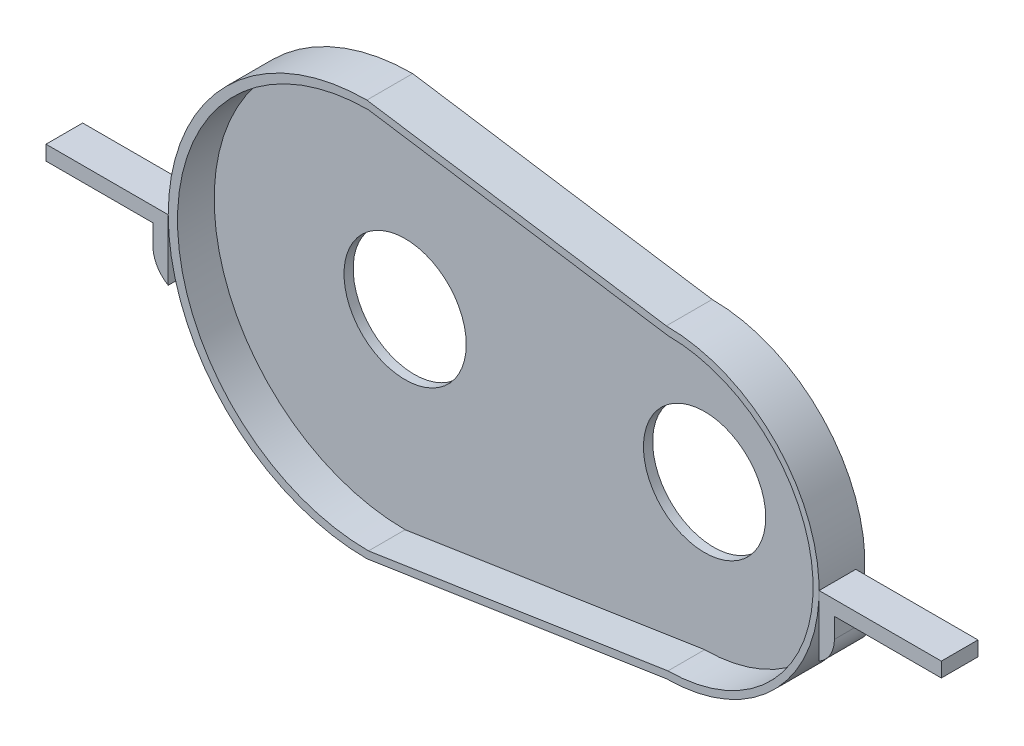
ISO-10303-21;
HEADER;
FILE_DESCRIPTION(('STEP AP214'),'2;1');
FILE_NAME('part.step','',(''),(''),'','','');
FILE_SCHEMA(('AUTOMOTIVE_DESIGN { 1 0 10303 214 1 1 1 1 }'));
ENDSEC;
DATA;
#1=APPLICATION_CONTEXT('core data for automotive mechanical design processes');
#2=APPLICATION_PROTOCOL_DEFINITION('international standard','automotive_design',2000,#1);
#3=PRODUCT_CONTEXT('',#1,'mechanical');
#4=PRODUCT('Part','Part','',(#3));
#5=PRODUCT_RELATED_PRODUCT_CATEGORY('part','',(#4));
#6=PRODUCT_DEFINITION_FORMATION('','',#4);
#7=PRODUCT_DEFINITION_CONTEXT('part definition',#1,'design');
#8=PRODUCT_DEFINITION('design','',#6,#7);
#9=PRODUCT_DEFINITION_SHAPE('','',#8);
#10=(LENGTH_UNIT() NAMED_UNIT(*) SI_UNIT(.MILLI.,.METRE.));
#11=(NAMED_UNIT(*) PLANE_ANGLE_UNIT() SI_UNIT($,.RADIAN.));
#12=(NAMED_UNIT(*) SI_UNIT($,.STERADIAN.) SOLID_ANGLE_UNIT());
#13=UNCERTAINTY_MEASURE_WITH_UNIT(LENGTH_MEASURE(1.E-05),#10,'distance_accuracy_value','');
#14=(GEOMETRIC_REPRESENTATION_CONTEXT(3) GLOBAL_UNCERTAINTY_ASSIGNED_CONTEXT((#13)) GLOBAL_UNIT_ASSIGNED_CONTEXT((#10,
#11,#12)) REPRESENTATION_CONTEXT('',''));
#15=CARTESIAN_POINT('',(0.,0.,0.));
#16=DIRECTION('',(0.,0.,1.));
#17=DIRECTION('',(1.,0.,0.));
#18=AXIS2_PLACEMENT_3D('',#15,#16,#17);
#19=CARTESIAN_POINT('',(-161.393356643357,-4.8015420475913,0.));
#20=DIRECTION('',(-1.,0.,0.));
#21=DIRECTION('',(0.,0.,1.));
#22=AXIS2_PLACEMENT_3D('',#19,#20,#21);
#23=PLANE('',#22);
#24=DIRECTION('',(0.,1.,0.));
#25=VECTOR('',#24,1.);
#26=CARTESIAN_POINT('',(-161.393356643357,-4.8015420475913,-12.));
#27=LINE('',#26,#25);
#28=CARTESIAN_POINT('',(-161.393356643357,-4.8015420475913,-12.));
#29=VERTEX_POINT('',#28);
#30=CARTESIAN_POINT('',(-161.393356643357,0.,-12.));
#31=VERTEX_POINT('',#30);
#32=EDGE_CURVE('E109',#29,#31,#27,.T.);
#33=ORIENTED_EDGE('',*,*,#32,.F.);
#34=DIRECTION('',(0.,0.,-1.));
#35=VECTOR('',#34,1.);
#36=CARTESIAN_POINT('',(-161.393356643357,-4.8015420475913,0.));
#37=LINE('',#36,#35);
#38=CARTESIAN_POINT('',(-161.393356643357,-4.8015420475913,0.));
#39=VERTEX_POINT('',#38);
#40=EDGE_CURVE('E95',#39,#29,#37,.T.);
#41=ORIENTED_EDGE('',*,*,#40,.F.);
#42=DIRECTION('',(0.,1.,0.));
#43=VECTOR('',#42,1.);
#44=CARTESIAN_POINT('',(-161.393356643357,-4.8015420475913,0.));
#45=LINE('',#44,#43);
#46=CARTESIAN_POINT('',(-161.393356643357,0.,0.));
#47=VERTEX_POINT('',#46);
#48=EDGE_CURVE('E118',#39,#47,#45,.T.);
#49=ORIENTED_EDGE('',*,*,#48,.T.);
#50=DIRECTION('',(0.,0.,-1.));
#51=VECTOR('',#50,1.);
#52=CARTESIAN_POINT('',(-161.393356643357,0.,0.));
#53=LINE('',#52,#51);
#54=EDGE_CURVE('E110',#47,#31,#53,.T.);
#55=ORIENTED_EDGE('',*,*,#54,.T.);
#56=EDGE_LOOP('',(#33,#41,#49,#55));
#57=FACE_BOUND('',#56,.T.);
#58=ADVANCED_FACE('F44',(#57),#23,.T.);
#59=CARTESIAN_POINT('',(-126.393356643357,-4.8015420475913,0.));
#60=DIRECTION('',(0.,-1.,0.));
#61=DIRECTION('',(1.,0.,0.));
#62=AXIS2_PLACEMENT_3D('',#59,#60,#61);
#63=PLANE('',#62);
#64=DIRECTION('',(-1.,0.,0.));
#65=VECTOR('',#64,1.);
#66=CARTESIAN_POINT('',(-126.393356643357,-4.8015420475913,-12.));
#67=LINE('',#66,#65);
#68=CARTESIAN_POINT('',(-126.393356643357,-4.8015420475913,-12.));
#69=VERTEX_POINT('',#68);
#70=EDGE_CURVE('E100',#69,#29,#67,.T.);
#71=ORIENTED_EDGE('',*,*,#70,.F.);
#72=DIRECTION('',(0.,0.,-1.));
#73=VECTOR('',#72,1.);
#74=CARTESIAN_POINT('',(-126.393356643357,-4.8015420475913,0.));
#75=LINE('',#74,#73);
#76=CARTESIAN_POINT('',(-126.393356643357,-4.8015420475913,0.));
#77=VERTEX_POINT('',#76);
#78=EDGE_CURVE('E106',#77,#69,#75,.T.);
#79=ORIENTED_EDGE('',*,*,#78,.F.);
#80=DIRECTION('',(-1.,0.,0.));
#81=VECTOR('',#80,1.);
#82=CARTESIAN_POINT('',(-126.393356643357,-4.8015420475913,0.));
#83=LINE('',#82,#81);
#84=EDGE_CURVE('E102',#77,#39,#83,.T.);
#85=ORIENTED_EDGE('',*,*,#84,.T.);
#86=ORIENTED_EDGE('',*,*,#40,.T.);
#87=EDGE_LOOP('',(#71,#79,#85,#86));
#88=FACE_BOUND('',#87,.T.);
#89=ADVANCED_FACE('F97',(#88),#63,.T.);
#90=CARTESIAN_POINT('',(-126.393356643357,-20.,0.));
#91=DIRECTION('',(-1.,0.,0.));
#92=DIRECTION('',(0.,0.,1.));
#93=AXIS2_PLACEMENT_3D('',#90,#91,#92);
#94=PLANE('',#93);
#95=DIRECTION('',(0.,1.,0.));
#96=VECTOR('',#95,1.);
#97=CARTESIAN_POINT('',(-126.393356643357,-20.,-12.));
#98=LINE('',#97,#96);
#99=CARTESIAN_POINT('',(-126.393356643357,-11.3397459621556,-12.));
#100=VERTEX_POINT('',#99);
#101=EDGE_CURVE('E116',#100,#69,#98,.T.);
#102=ORIENTED_EDGE('',*,*,#101,.F.);
#103=DIRECTION('',(0.,0.,-1.));
#104=VECTOR('',#103,1.);
#105=CARTESIAN_POINT('',(-126.393356643357,-11.3397459621556,0.));
#106=LINE('',#105,#104);
#107=CARTESIAN_POINT('',(-126.393356643357,-11.3397459621556,0.));
#108=VERTEX_POINT('',#107);
#109=EDGE_CURVE('E52',#100,#108,#106,.F.);
#110=ORIENTED_EDGE('',*,*,#109,.T.);
#111=DIRECTION('',(0.,1.,0.));
#112=VECTOR('',#111,1.);
#113=CARTESIAN_POINT('',(-126.393356643357,-20.,0.));
#114=LINE('',#113,#112);
#115=EDGE_CURVE('E129',#108,#77,#114,.T.);
#116=ORIENTED_EDGE('',*,*,#115,.T.);
#117=ORIENTED_EDGE('',*,*,#78,.T.);
#118=EDGE_LOOP('',(#102,#110,#116,#117));
#119=FACE_BOUND('',#118,.T.);
#120=ADVANCED_FACE('F154',(#119),#94,.T.);
#121=CARTESIAN_POINT('',(-121.393356643357,0.,0.));
#122=DIRECTION('',(1.,0.,0.));
#123=DIRECTION('',(0.,0.,-1.));
#124=AXIS2_PLACEMENT_3D('',#121,#122,#123);
#125=PLANE('',#124);
#126=DIRECTION('',(0.,-1.,0.));
#127=VECTOR('',#126,1.);
#128=CARTESIAN_POINT('',(-121.393356643357,0.,-12.));
#129=LINE('',#128,#127);
#130=CARTESIAN_POINT('',(-121.393356643357,0.,-12.));
#131=VERTEX_POINT('',#130);
#132=CARTESIAN_POINT('',(-121.393356643357,-20.,-12.));
#133=VERTEX_POINT('',#132);
#134=EDGE_CURVE('E120',#131,#133,#129,.T.);
#135=ORIENTED_EDGE('',*,*,#134,.F.);
#136=DIRECTION('',(0.,0.,-1.));
#137=VECTOR('',#136,1.);
#138=CARTESIAN_POINT('',(-121.393356643357,0.,0.));
#139=LINE('',#138,#137);
#140=CARTESIAN_POINT('',(-121.393356643357,0.,0.));
#141=VERTEX_POINT('',#140);
#142=EDGE_CURVE('E139',#141,#131,#139,.T.);
#143=ORIENTED_EDGE('',*,*,#142,.F.);
#144=DIRECTION('',(0.,-1.,0.));
#145=VECTOR('',#144,1.);
#146=CARTESIAN_POINT('',(-121.393356643357,0.,0.));
#147=LINE('',#146,#145);
#148=CARTESIAN_POINT('',(-121.393356643357,-20.,0.));
#149=VERTEX_POINT('',#148);
#150=EDGE_CURVE('E131',#141,#149,#147,.T.);
#151=ORIENTED_EDGE('',*,*,#150,.T.);
#152=DIRECTION('',(0.,0.,-1.));
#153=VECTOR('',#152,1.);
#154=CARTESIAN_POINT('',(-121.393356643357,-20.,0.));
#155=LINE('',#154,#153);
#156=EDGE_CURVE('E149',#149,#133,#155,.T.);
#157=ORIENTED_EDGE('',*,*,#156,.T.);
#158=EDGE_LOOP('',(#135,#143,#151,#157));
#159=FACE_BOUND('',#158,.T.);
#160=ADVANCED_FACE('F148',(#159),#125,.T.);
#161=CARTESIAN_POINT('',(-161.393356643357,0.,0.));
#162=DIRECTION('',(0.,1.,0.));
#163=DIRECTION('',(-1.,0.,0.));
#164=AXIS2_PLACEMENT_3D('',#161,#162,#163);
#165=PLANE('',#164);
#166=DIRECTION('',(1.,0.,0.));
#167=VECTOR('',#166,1.);
#168=CARTESIAN_POINT('',(-161.393356643357,0.,-12.));
#169=LINE('',#168,#167);
#170=EDGE_CURVE('E113',#31,#131,#169,.T.);
#171=ORIENTED_EDGE('',*,*,#170,.F.);
#172=ORIENTED_EDGE('',*,*,#54,.F.);
#173=DIRECTION('',(1.,0.,0.));
#174=VECTOR('',#173,1.);
#175=CARTESIAN_POINT('',(-161.393356643357,0.,0.));
#176=LINE('',#175,#174);
#177=EDGE_CURVE('E122',#47,#141,#176,.T.);
#178=ORIENTED_EDGE('',*,*,#177,.T.);
#179=ORIENTED_EDGE('',*,*,#142,.T.);
#180=EDGE_LOOP('',(#171,#172,#178,#179));
#181=FACE_BOUND('',#180,.T.);
#182=ADVANCED_FACE('F138',(#181),#165,.T.);
#183=CARTESIAN_POINT('',(0.,0.,0.));
#184=DIRECTION('',(0.,0.,-1.));
#185=DIRECTION('',(-1.,0.,0.));
#186=AXIS2_PLACEMENT_3D('',#183,#184,#185);
#187=PLANE('',#186);
#188=ORIENTED_EDGE('',*,*,#115,.F.);
#189=CARTESIAN_POINT('',(-116.393356643357,-11.3397459621556,0.));
#190=DIRECTION('',(0.,0.,-1.));
#191=DIRECTION('',(-1.,0.,0.));
#192=AXIS2_PLACEMENT_3D('',#189,#190,#191);
#193=CIRCLE('',#192,10.);
#194=EDGE_CURVE('E12',#108,#149,#193,.F.);
#195=ORIENTED_EDGE('',*,*,#194,.T.);
#196=ORIENTED_EDGE('',*,*,#150,.F.);
#197=ORIENTED_EDGE('',*,*,#177,.F.);
#198=ORIENTED_EDGE('',*,*,#48,.F.);
#199=ORIENTED_EDGE('',*,*,#84,.F.);
#200=EDGE_LOOP('',(#188,#195,#196,#197,#198,#199));
#201=FACE_BOUND('',#200,.T.);
#202=ADVANCED_FACE('F143',(#201),#187,.F.);
#203=CARTESIAN_POINT('',(0.,0.,-12.));
#204=DIRECTION('',(0.,0.,-1.));
#205=DIRECTION('',(-1.,0.,0.));
#206=AXIS2_PLACEMENT_3D('',#203,#204,#205);
#207=PLANE('',#206);
#208=ORIENTED_EDGE('',*,*,#134,.T.);
#209=CARTESIAN_POINT('',(-116.393356643357,-11.3397459621556,-12.));
#210=DIRECTION('',(0.,0.,-1.));
#211=DIRECTION('',(-1.,0.,0.));
#212=AXIS2_PLACEMENT_3D('',#209,#210,#211);
#213=CIRCLE('',#212,10.);
#214=EDGE_CURVE('E66',#133,#100,#213,.T.);
#215=ORIENTED_EDGE('',*,*,#214,.T.);
#216=ORIENTED_EDGE('',*,*,#101,.T.);
#217=ORIENTED_EDGE('',*,*,#70,.T.);
#218=ORIENTED_EDGE('',*,*,#32,.T.);
#219=ORIENTED_EDGE('',*,*,#170,.T.);
#220=EDGE_LOOP('',(#208,#215,#216,#217,#218,#219));
#221=FACE_BOUND('',#220,.T.);
#222=ADVANCED_FACE('F115',(#221),#207,.T.);
#223=CARTESIAN_POINT('',(-116.393356643357,-11.3397459621556,0.));
#224=DIRECTION('',(0.,0.,1.));
#225=DIRECTION('',(1.,0.,0.));
#226=AXIS2_PLACEMENT_3D('',#223,#224,#225);
#227=CYLINDRICAL_SURFACE('',#226,10.);
#228=ORIENTED_EDGE('',*,*,#194,.F.);
#229=ORIENTED_EDGE('',*,*,#109,.F.);
#230=ORIENTED_EDGE('',*,*,#214,.F.);
#231=ORIENTED_EDGE('',*,*,#156,.F.);
#232=EDGE_LOOP('',(#228,#229,#230,#231));
#233=FACE_BOUND('',#232,.T.);
#234=ADVANCED_FACE('F46',(#233),#227,.T.);
#235=CLOSED_SHELL('',(#58,#89,#120,#160,#182,#202,#222,#234));
#236=MANIFOLD_SOLID_BREP('B2',#235);
#237=CARTESIAN_POINT('',(131.606643356643,0.,0.));
#238=DIRECTION('',(1.,0.,0.));
#239=DIRECTION('',(0.,0.,-1.));
#240=AXIS2_PLACEMENT_3D('',#237,#238,#239);
#241=PLANE('',#240);
#242=DIRECTION('',(0.,-1.,0.));
#243=VECTOR('',#242,1.);
#244=CARTESIAN_POINT('',(131.606643356643,0.,-12.));
#245=LINE('',#244,#243);
#246=CARTESIAN_POINT('',(131.606643356643,0.,-12.));
#247=VERTEX_POINT('',#246);
#248=CARTESIAN_POINT('',(131.606643356643,-4.80154204759129,-12.));
#249=VERTEX_POINT('',#248);
#250=EDGE_CURVE('E314',#247,#249,#245,.T.);
#251=ORIENTED_EDGE('',*,*,#250,.F.);
#252=DIRECTION('',(0.,0.,-1.));
#253=VECTOR('',#252,1.);
#254=CARTESIAN_POINT('',(131.606643356643,0.,0.));
#255=LINE('',#254,#253);
#256=CARTESIAN_POINT('',(131.606643356643,0.,0.));
#257=VERTEX_POINT('',#256);
#258=EDGE_CURVE('E302',#257,#247,#255,.T.);
#259=ORIENTED_EDGE('',*,*,#258,.F.);
#260=DIRECTION('',(0.,-1.,0.));
#261=VECTOR('',#260,1.);
#262=CARTESIAN_POINT('',(131.606643356643,0.,0.));
#263=LINE('',#262,#261);
#264=CARTESIAN_POINT('',(131.606643356643,-4.80154204759129,0.));
#265=VERTEX_POINT('',#264);
#266=EDGE_CURVE('E298',#257,#265,#263,.T.);
#267=ORIENTED_EDGE('',*,*,#266,.T.);
#268=DIRECTION('',(0.,0.,-1.));
#269=VECTOR('',#268,1.);
#270=CARTESIAN_POINT('',(131.606643356643,-4.80154204759129,0.));
#271=LINE('',#270,#269);
#272=EDGE_CURVE('E282',#265,#249,#271,.T.);
#273=ORIENTED_EDGE('',*,*,#272,.T.);
#274=EDGE_LOOP('',(#251,#259,#267,#273));
#275=FACE_BOUND('',#274,.T.);
#276=ADVANCED_FACE('F229',(#275),#241,.T.);
#277=CARTESIAN_POINT('',(91.6066433566433,0.,0.));
#278=DIRECTION('',(0.,1.,0.));
#279=DIRECTION('',(0.,0.,1.));
#280=AXIS2_PLACEMENT_3D('',#277,#278,#279);
#281=PLANE('',#280);
#282=DIRECTION('',(1.,0.,0.));
#283=VECTOR('',#282,1.);
#284=CARTESIAN_POINT('',(91.6066433566433,0.,-12.));
#285=LINE('',#284,#283);
#286=CARTESIAN_POINT('',(91.6066433566433,0.,-12.));
#287=VERTEX_POINT('',#286);
#288=EDGE_CURVE('E303',#287,#247,#285,.T.);
#289=ORIENTED_EDGE('',*,*,#288,.F.);
#290=DIRECTION('',(0.,0.,-1.));
#291=VECTOR('',#290,1.);
#292=CARTESIAN_POINT('',(91.6066433566433,0.,0.));
#293=LINE('',#292,#291);
#294=CARTESIAN_POINT('',(91.6066433566433,0.,0.));
#295=VERTEX_POINT('',#294);
#296=EDGE_CURVE('E324',#295,#287,#293,.T.);
#297=ORIENTED_EDGE('',*,*,#296,.F.);
#298=DIRECTION('',(1.,0.,0.));
#299=VECTOR('',#298,1.);
#300=CARTESIAN_POINT('',(91.6066433566433,0.,0.));
#301=LINE('',#300,#299);
#302=EDGE_CURVE('E293',#295,#257,#301,.T.);
#303=ORIENTED_EDGE('',*,*,#302,.T.);
#304=ORIENTED_EDGE('',*,*,#258,.T.);
#305=EDGE_LOOP('',(#289,#297,#303,#304));
#306=FACE_BOUND('',#305,.T.);
#307=ADVANCED_FACE('F339',(#306),#281,.T.);
#308=CARTESIAN_POINT('',(91.6066433566433,-20.,0.));
#309=DIRECTION('',(-1.,0.,0.));
#310=DIRECTION('',(0.,0.,1.));
#311=AXIS2_PLACEMENT_3D('',#308,#309,#310);
#312=PLANE('',#311);
#313=DIRECTION('',(0.,1.,0.));
#314=VECTOR('',#313,1.);
#315=CARTESIAN_POINT('',(91.6066433566433,-20.,-12.));
#316=LINE('',#315,#314);
#317=CARTESIAN_POINT('',(91.6066433566433,-20.,-12.));
#318=VERTEX_POINT('',#317);
#319=EDGE_CURVE('E306',#318,#287,#316,.T.);
#320=ORIENTED_EDGE('',*,*,#319,.F.);
#321=DIRECTION('',(0.,0.,-1.));
#322=VECTOR('',#321,1.);
#323=CARTESIAN_POINT('',(91.6066433566433,-20.,0.));
#324=LINE('',#323,#322);
#325=CARTESIAN_POINT('',(91.6066433566433,-20.,0.));
#326=VERTEX_POINT('',#325);
#327=EDGE_CURVE('E326',#326,#318,#324,.T.);
#328=ORIENTED_EDGE('',*,*,#327,.F.);
#329=DIRECTION('',(0.,1.,0.));
#330=VECTOR('',#329,1.);
#331=CARTESIAN_POINT('',(91.6066433566433,-20.,0.));
#332=LINE('',#331,#330);
#333=EDGE_CURVE('E310',#326,#295,#332,.T.);
#334=ORIENTED_EDGE('',*,*,#333,.T.);
#335=ORIENTED_EDGE('',*,*,#296,.T.);
#336=EDGE_LOOP('',(#320,#328,#334,#335));
#337=FACE_BOUND('',#336,.T.);
#338=ADVANCED_FACE('F335',(#337),#312,.T.);
#339=CARTESIAN_POINT('',(96.6066433566433,-4.8015420475913,0.));
#340=DIRECTION('',(1.,0.,0.));
#341=DIRECTION('',(0.,0.,-1.));
#342=AXIS2_PLACEMENT_3D('',#339,#340,#341);
#343=PLANE('',#342);
#344=DIRECTION('',(0.,-1.,0.));
#345=VECTOR('',#344,1.);
#346=CARTESIAN_POINT('',(96.6066433566433,-4.8015420475913,0.));
#347=LINE('',#346,#345);
#348=CARTESIAN_POINT('',(96.6066433566433,-4.8015420475913,0.));
#349=VERTEX_POINT('',#348);
#350=CARTESIAN_POINT('',(96.6066433566433,-11.3397459621556,0.));
#351=VERTEX_POINT('',#350);
#352=EDGE_CURVE('E300',#349,#351,#347,.T.);
#353=ORIENTED_EDGE('',*,*,#352,.T.);
#354=DIRECTION('',(0.,0.,1.));
#355=VECTOR('',#354,1.);
#356=CARTESIAN_POINT('',(96.6066433566433,-11.3397459621556,-12.));
#357=LINE('',#356,#355);
#358=CARTESIAN_POINT('',(96.6066433566433,-11.3397459621556,-12.));
#359=VERTEX_POINT('',#358);
#360=EDGE_CURVE('E323',#351,#359,#357,.F.);
#361=ORIENTED_EDGE('',*,*,#360,.T.);
#362=DIRECTION('',(0.,-1.,0.));
#363=VECTOR('',#362,1.);
#364=CARTESIAN_POINT('',(96.6066433566433,-4.8015420475913,-12.));
#365=LINE('',#364,#363);
#366=CARTESIAN_POINT('',(96.6066433566433,-4.8015420475913,-12.));
#367=VERTEX_POINT('',#366);
#368=EDGE_CURVE('E317',#367,#359,#365,.T.);
#369=ORIENTED_EDGE('',*,*,#368,.F.);
#370=DIRECTION('',(0.,0.,-1.));
#371=VECTOR('',#370,1.);
#372=CARTESIAN_POINT('',(96.6066433566433,-4.8015420475913,0.));
#373=LINE('',#372,#371);
#374=EDGE_CURVE('E292',#349,#367,#373,.T.);
#375=ORIENTED_EDGE('',*,*,#374,.F.);
#376=EDGE_LOOP('',(#353,#361,#369,#375));
#377=FACE_BOUND('',#376,.T.);
#378=ADVANCED_FACE('F337',(#377),#343,.T.);
#379=CARTESIAN_POINT('',(131.606643356643,-4.80154204759129,0.));
#380=DIRECTION('',(0.,-1.,0.));
#381=DIRECTION('',(1.,0.,0.));
#382=AXIS2_PLACEMENT_3D('',#379,#380,#381);
#383=PLANE('',#382);
#384=DIRECTION('',(-1.,0.,0.));
#385=VECTOR('',#384,1.);
#386=CARTESIAN_POINT('',(131.606643356643,-4.80154204759129,-12.));
#387=LINE('',#386,#385);
#388=EDGE_CURVE('E287',#249,#367,#387,.T.);
#389=ORIENTED_EDGE('',*,*,#388,.F.);
#390=ORIENTED_EDGE('',*,*,#272,.F.);
#391=DIRECTION('',(-1.,0.,0.));
#392=VECTOR('',#391,1.);
#393=CARTESIAN_POINT('',(131.606643356643,-4.80154204759129,0.));
#394=LINE('',#393,#392);
#395=EDGE_CURVE('E285',#265,#349,#394,.T.);
#396=ORIENTED_EDGE('',*,*,#395,.T.);
#397=ORIENTED_EDGE('',*,*,#374,.T.);
#398=EDGE_LOOP('',(#389,#390,#396,#397));
#399=FACE_BOUND('',#398,.T.);
#400=ADVANCED_FACE('F284',(#399),#383,.T.);
#401=CARTESIAN_POINT('',(0.,0.,0.));
#402=DIRECTION('',(0.,0.,-1.));
#403=DIRECTION('',(-1.,0.,0.));
#404=AXIS2_PLACEMENT_3D('',#401,#402,#403);
#405=PLANE('',#404);
#406=ORIENTED_EDGE('',*,*,#333,.F.);
#407=CARTESIAN_POINT('',(86.6066433566433,-11.3397459621556,0.));
#408=DIRECTION('',(0.,0.,-1.));
#409=DIRECTION('',(-1.,0.,0.));
#410=AXIS2_PLACEMENT_3D('',#407,#408,#409);
#411=CIRCLE('',#410,10.);
#412=EDGE_CURVE('E42',#326,#351,#411,.F.);
#413=ORIENTED_EDGE('',*,*,#412,.T.);
#414=ORIENTED_EDGE('',*,*,#352,.F.);
#415=ORIENTED_EDGE('',*,*,#395,.F.);
#416=ORIENTED_EDGE('',*,*,#266,.F.);
#417=ORIENTED_EDGE('',*,*,#302,.F.);
#418=EDGE_LOOP('',(#406,#413,#414,#415,#416,#417));
#419=FACE_BOUND('',#418,.T.);
#420=ADVANCED_FACE('F296',(#419),#405,.F.);
#421=CARTESIAN_POINT('',(0.,0.,-12.));
#422=DIRECTION('',(0.,0.,-1.));
#423=DIRECTION('',(-1.,0.,0.));
#424=AXIS2_PLACEMENT_3D('',#421,#422,#423);
#425=PLANE('',#424);
#426=ORIENTED_EDGE('',*,*,#368,.T.);
#427=CARTESIAN_POINT('',(86.6066433566433,-11.3397459621556,-12.));
#428=DIRECTION('',(0.,0.,-1.));
#429=DIRECTION('',(-1.,0.,0.));
#430=AXIS2_PLACEMENT_3D('',#427,#428,#429);
#431=CIRCLE('',#430,10.);
#432=EDGE_CURVE('E237',#359,#318,#431,.T.);
#433=ORIENTED_EDGE('',*,*,#432,.T.);
#434=ORIENTED_EDGE('',*,*,#319,.T.);
#435=ORIENTED_EDGE('',*,*,#288,.T.);
#436=ORIENTED_EDGE('',*,*,#250,.T.);
#437=ORIENTED_EDGE('',*,*,#388,.T.);
#438=EDGE_LOOP('',(#426,#433,#434,#435,#436,#437));
#439=FACE_BOUND('',#438,.T.);
#440=ADVANCED_FACE('F331',(#439),#425,.T.);
#441=CARTESIAN_POINT('',(86.6066433566433,-11.3397459621556,0.));
#442=DIRECTION('',(0.,0.,-1.));
#443=DIRECTION('',(-1.,0.,0.));
#444=AXIS2_PLACEMENT_3D('',#441,#442,#443);
#445=CYLINDRICAL_SURFACE('',#444,10.);
#446=ORIENTED_EDGE('',*,*,#412,.F.);
#447=ORIENTED_EDGE('',*,*,#327,.T.);
#448=ORIENTED_EDGE('',*,*,#432,.F.);
#449=ORIENTED_EDGE('',*,*,#360,.F.);
#450=EDGE_LOOP('',(#446,#447,#448,#449));
#451=FACE_BOUND('',#450,.T.);
#452=ADVANCED_FACE('F231',(#451),#445,.T.);
#453=CLOSED_SHELL('',(#276,#307,#338,#378,#400,#420,#440,#452));
#454=MANIFOLD_SOLID_BREP('B6',#453);
#455=CARTESIAN_POINT('',(-56.3933566433567,0.,-15.));
#456=DIRECTION('',(0.,0.,1.));
#457=DIRECTION('',(1.,0.,0.));
#458=AXIS2_PLACEMENT_3D('',#455,#456,#457);
#459=CYLINDRICAL_SURFACE('',#458,65.);
#460=CARTESIAN_POINT('',(-56.3933566433567,0.,0.));
#461=DIRECTION('',(0.,0.,1.));
#462=DIRECTION('',(1.,0.,0.));
#463=AXIS2_PLACEMENT_3D('',#460,#461,#462);
#464=CIRCLE('',#463,65.);
#465=CARTESIAN_POINT('',(-56.3933566433567,65.,0.));
#466=VERTEX_POINT('',#465);
#467=CARTESIAN_POINT('',(-56.3933566433567,-65.,0.));
#468=VERTEX_POINT('',#467);
#469=EDGE_CURVE('E516',#466,#468,#464,.T.);
#470=ORIENTED_EDGE('',*,*,#469,.F.);
#471=DIRECTION('',(0.,0.,1.));
#472=VECTOR('',#471,1.);
#473=CARTESIAN_POINT('',(-56.3933566433567,65.,-15.));
#474=LINE('',#473,#472);
#475=CARTESIAN_POINT('',(-56.3933566433567,65.,-15.));
#476=VERTEX_POINT('',#475);
#477=EDGE_CURVE('E227',#476,#466,#474,.T.);
#478=ORIENTED_EDGE('',*,*,#477,.F.);
#479=CARTESIAN_POINT('',(-56.3933566433567,0.,-15.));
#480=DIRECTION('',(0.,0.,1.));
#481=DIRECTION('',(1.,0.,0.));
#482=AXIS2_PLACEMENT_3D('',#479,#480,#481);
#483=CIRCLE('',#482,65.);
#484=CARTESIAN_POINT('',(-56.3933566433567,-65.,-15.));
#485=VERTEX_POINT('',#484);
#486=EDGE_CURVE('E520',#476,#485,#483,.T.);
#487=ORIENTED_EDGE('',*,*,#486,.T.);
#488=DIRECTION('',(0.,0.,1.));
#489=VECTOR('',#488,1.);
#490=CARTESIAN_POINT('',(-56.3933566433567,-65.,-15.));
#491=LINE('',#490,#489);
#492=EDGE_CURVE('E408',#485,#468,#491,.T.);
#493=ORIENTED_EDGE('',*,*,#492,.T.);
#494=EDGE_LOOP('',(#470,#478,#487,#493));
#495=FACE_BOUND('',#494,.T.);
#496=ADVANCED_FACE('F405',(#495),#459,.T.);
#497=CARTESIAN_POINT('',(-56.3933566433567,65.,-15.));
#498=DIRECTION('',(-0.151299186009207,-0.98848801526015,0.));
#499=DIRECTION('',(0.988488015260151,-0.151299186009207,0.));
#500=AXIS2_PLACEMENT_3D('',#497,#498,#499);
#501=PLANE('',#500);
#502=DIRECTION('',(0.988488015260151,-0.151299186009207,0.));
#503=VECTOR('',#502,1.);
#504=CARTESIAN_POINT('',(-56.3933566433567,65.,0.));
#505=LINE('',#504,#503);
#506=CARTESIAN_POINT('',(41.6066433566433,50.,0.));
#507=VERTEX_POINT('',#506);
#508=EDGE_CURVE('E523',#466,#507,#505,.T.);
#509=ORIENTED_EDGE('',*,*,#508,.T.);
#510=DIRECTION('',(0.,0.,1.));
#511=VECTOR('',#510,1.);
#512=CARTESIAN_POINT('',(41.6066433566433,50.,-15.));
#513=LINE('',#512,#511);
#514=CARTESIAN_POINT('',(41.6066433566433,50.,-15.));
#515=VERTEX_POINT('',#514);
#516=EDGE_CURVE('E413',#515,#507,#513,.T.);
#517=ORIENTED_EDGE('',*,*,#516,.F.);
#518=DIRECTION('',(0.988488015260151,-0.151299186009207,0.));
#519=VECTOR('',#518,1.);
#520=CARTESIAN_POINT('',(-56.3933566433567,65.,-15.));
#521=LINE('',#520,#519);
#522=EDGE_CURVE('E528',#476,#515,#521,.T.);
#523=ORIENTED_EDGE('',*,*,#522,.F.);
#524=ORIENTED_EDGE('',*,*,#477,.T.);
#525=EDGE_LOOP('',(#509,#517,#523,#524));
#526=FACE_BOUND('',#525,.T.);
#527=ADVANCED_FACE('F545',(#526),#501,.F.);
#528=CARTESIAN_POINT('',(41.6066433566433,0.,-15.));
#529=DIRECTION('',(0.,0.,1.));
#530=DIRECTION('',(1.,0.,0.));
#531=AXIS2_PLACEMENT_3D('',#528,#529,#530);
#532=CYLINDRICAL_SURFACE('',#531,50.);
#533=CARTESIAN_POINT('',(41.6066433566433,0.,0.));
#534=DIRECTION('',(0.,0.,1.));
#535=DIRECTION('',(1.,0.,0.));
#536=AXIS2_PLACEMENT_3D('',#533,#534,#535);
#537=CIRCLE('',#536,50.);
#538=CARTESIAN_POINT('',(41.6066433566433,-50.,0.));
#539=VERTEX_POINT('',#538);
#540=EDGE_CURVE('E534',#539,#507,#537,.T.);
#541=ORIENTED_EDGE('',*,*,#540,.F.);
#542=DIRECTION('',(0.,0.,1.));
#543=VECTOR('',#542,1.);
#544=CARTESIAN_POINT('',(41.6066433566433,-50.,-15.));
#545=LINE('',#544,#543);
#546=CARTESIAN_POINT('',(41.6066433566433,-50.,-15.));
#547=VERTEX_POINT('',#546);
#548=EDGE_CURVE('E538',#547,#539,#545,.T.);
#549=ORIENTED_EDGE('',*,*,#548,.F.);
#550=CARTESIAN_POINT('',(41.6066433566433,0.,-15.));
#551=DIRECTION('',(0.,0.,1.));
#552=DIRECTION('',(1.,0.,0.));
#553=AXIS2_PLACEMENT_3D('',#550,#551,#552);
#554=CIRCLE('',#553,50.);
#555=EDGE_CURVE('E525',#547,#515,#554,.T.);
#556=ORIENTED_EDGE('',*,*,#555,.T.);
#557=ORIENTED_EDGE('',*,*,#516,.T.);
#558=EDGE_LOOP('',(#541,#549,#556,#557));
#559=FACE_BOUND('',#558,.T.);
#560=ADVANCED_FACE('F548',(#559),#532,.T.);
#561=CARTESIAN_POINT('',(-56.3933566433567,-65.,-15.));
#562=DIRECTION('',(0.151299186009207,-0.98848801526015,0.));
#563=DIRECTION('',(0.988488015260151,0.151299186009207,0.));
#564=AXIS2_PLACEMENT_3D('',#561,#562,#563);
#565=PLANE('',#564);
#566=DIRECTION('',(0.988488015260151,0.151299186009207,0.));
#567=VECTOR('',#566,1.);
#568=CARTESIAN_POINT('',(-56.3933566433567,-65.,0.));
#569=LINE('',#568,#567);
#570=EDGE_CURVE('E531',#468,#539,#569,.T.);
#571=ORIENTED_EDGE('',*,*,#570,.F.);
#572=ORIENTED_EDGE('',*,*,#492,.F.);
#573=DIRECTION('',(0.988488015260151,0.151299186009207,0.));
#574=VECTOR('',#573,1.);
#575=CARTESIAN_POINT('',(-56.3933566433567,-65.,-15.));
#576=LINE('',#575,#574);
#577=EDGE_CURVE('E522',#485,#547,#576,.T.);
#578=ORIENTED_EDGE('',*,*,#577,.T.);
#579=ORIENTED_EDGE('',*,*,#548,.T.);
#580=EDGE_LOOP('',(#571,#572,#578,#579));
#581=FACE_BOUND('',#580,.T.);
#582=ADVANCED_FACE('F541',(#581),#565,.T.);
#583=CARTESIAN_POINT('',(-56.3933566433567,0.,-15.));
#584=DIRECTION('',(0.,0.,1.));
#585=DIRECTION('',(1.,0.,0.));
#586=AXIS2_PLACEMENT_3D('',#583,#584,#585);
#587=PLANE('',#586);
#588=CARTESIAN_POINT('',(42.1297835505631,0.,-15.));
#589=DIRECTION('',(0.,0.,1.));
#590=DIRECTION('',(1.,0.,0.));
#591=AXIS2_PLACEMENT_3D('',#588,#589,#590);
#592=CIRCLE('',#591,20.);
#593=CARTESIAN_POINT('',(62.1297835505631,0.,-15.));
#594=VERTEX_POINT('',#593);
#595=EDGE_CURVE('E658',#594,#594,#592,.T.);
#596=ORIENTED_EDGE('',*,*,#595,.T.);
#597=EDGE_LOOP('',(#596));
#598=FACE_BOUND('',#597,.T.);
#599=CARTESIAN_POINT('',(-55.8702164494369,0.,-15.));
#600=DIRECTION('',(0.,0.,1.));
#601=DIRECTION('',(1.,0.,0.));
#602=AXIS2_PLACEMENT_3D('',#599,#600,#601);
#603=CIRCLE('',#602,20.);
#604=CARTESIAN_POINT('',(-35.8702164494369,0.,-15.));
#605=VERTEX_POINT('',#604);
#606=EDGE_CURVE('E504',#605,#605,#603,.T.);
#607=ORIENTED_EDGE('',*,*,#606,.T.);
#608=EDGE_LOOP('',(#607));
#609=FACE_BOUND('',#608,.T.);
#610=ORIENTED_EDGE('',*,*,#486,.F.);
#611=ORIENTED_EDGE('',*,*,#522,.T.);
#612=ORIENTED_EDGE('',*,*,#555,.F.);
#613=ORIENTED_EDGE('',*,*,#577,.F.);
#614=EDGE_LOOP('',(#610,#611,#612,#613));
#615=FACE_BOUND('',#614,.T.);
#616=ADVANCED_FACE('F550',(#598,#609,#615),#587,.F.);
#617=CARTESIAN_POINT('',(-56.3933566433567,0.,0.));
#618=DIRECTION('',(0.,0.,1.));
#619=DIRECTION('',(1.,0.,0.));
#620=AXIS2_PLACEMENT_3D('',#617,#618,#619);
#621=PLANE('',#620);
#622=CARTESIAN_POINT('',(-55.8512880675139,0.,0.));
#623=DIRECTION('',(0.,0.,1.));
#624=DIRECTION('',(1.,0.,0.));
#625=AXIS2_PLACEMENT_3D('',#622,#623,#624);
#626=CIRCLE('',#625,62.5);
#627=CARTESIAN_POINT('',(-55.8512880675139,62.5,0.));
#628=VERTEX_POINT('',#627);
#629=CARTESIAN_POINT('',(-55.8512880675139,-62.5,0.));
#630=VERTEX_POINT('',#629);
#631=EDGE_CURVE('E421',#628,#630,#626,.T.);
#632=ORIENTED_EDGE('',*,*,#631,.F.);
#633=DIRECTION('',(-0.988488015260151,0.151299186009207,0.));
#634=VECTOR('',#633,1.);
#635=CARTESIAN_POINT('',(-55.8512880675139,62.5,0.));
#636=LINE('',#635,#634);
#637=CARTESIAN_POINT('',(42.1487119324861,47.5,0.));
#638=VERTEX_POINT('',#637);
#639=EDGE_CURVE('E498',#638,#628,#636,.T.);
#640=ORIENTED_EDGE('',*,*,#639,.F.);
#641=CARTESIAN_POINT('',(42.1487119324861,0.,0.));
#642=DIRECTION('',(0.,0.,1.));
#643=DIRECTION('',(1.,0.,0.));
#644=AXIS2_PLACEMENT_3D('',#641,#642,#643);
#645=CIRCLE('',#644,47.5);
#646=CARTESIAN_POINT('',(42.1487119324861,-47.5,0.));
#647=VERTEX_POINT('',#646);
#648=EDGE_CURVE('E501',#647,#638,#645,.T.);
#649=ORIENTED_EDGE('',*,*,#648,.F.);
#650=DIRECTION('',(0.988488015260151,0.151299186009207,0.));
#651=VECTOR('',#650,1.);
#652=CARTESIAN_POINT('',(-55.8512880675139,-62.5,0.));
#653=LINE('',#652,#651);
#654=EDGE_CURVE('E510',#630,#647,#653,.T.);
#655=ORIENTED_EDGE('',*,*,#654,.F.);
#656=EDGE_LOOP('',(#632,#640,#649,#655));
#657=FACE_BOUND('',#656,.T.);
#658=ORIENTED_EDGE('',*,*,#469,.T.);
#659=ORIENTED_EDGE('',*,*,#570,.T.);
#660=ORIENTED_EDGE('',*,*,#540,.T.);
#661=ORIENTED_EDGE('',*,*,#508,.F.);
#662=EDGE_LOOP('',(#658,#659,#660,#661));
#663=FACE_BOUND('',#662,.T.);
#664=ADVANCED_FACE('F543',(#657,#663),#621,.T.);
#665=CARTESIAN_POINT('',(-55.8512880675139,0.,-12.));
#666=DIRECTION('',(0.,0.,1.));
#667=DIRECTION('',(1.,0.,0.));
#668=AXIS2_PLACEMENT_3D('',#665,#666,#667);
#669=CYLINDRICAL_SURFACE('',#668,62.5);
#670=ORIENTED_EDGE('',*,*,#631,.T.);
#671=DIRECTION('',(0.,0.,1.));
#672=VECTOR('',#671,1.);
#673=CARTESIAN_POINT('',(-55.8512880675139,-62.5,-12.));
#674=LINE('',#673,#672);
#675=CARTESIAN_POINT('',(-55.8512880675139,-62.5,-12.));
#676=VERTEX_POINT('',#675);
#677=EDGE_CURVE('E476',#676,#630,#674,.T.);
#678=ORIENTED_EDGE('',*,*,#677,.F.);
#679=CARTESIAN_POINT('',(-55.8512880675139,0.,-12.));
#680=DIRECTION('',(0.,0.,1.));
#681=DIRECTION('',(1.,0.,0.));
#682=AXIS2_PLACEMENT_3D('',#679,#680,#681);
#683=CIRCLE('',#682,62.5);
#684=CARTESIAN_POINT('',(-55.8512880675139,62.5,-12.));
#685=VERTEX_POINT('',#684);
#686=EDGE_CURVE('E480',#685,#676,#683,.T.);
#687=ORIENTED_EDGE('',*,*,#686,.F.);
#688=DIRECTION('',(0.,0.,1.));
#689=VECTOR('',#688,1.);
#690=CARTESIAN_POINT('',(-55.8512880675139,62.5,-12.));
#691=LINE('',#690,#689);
#692=EDGE_CURVE('E514',#685,#628,#691,.T.);
#693=ORIENTED_EDGE('',*,*,#692,.T.);
#694=EDGE_LOOP('',(#670,#678,#687,#693));
#695=FACE_BOUND('',#694,.T.);
#696=ADVANCED_FACE('F478',(#695),#669,.F.);
#697=CARTESIAN_POINT('',(-55.8512880675139,62.5,-12.));
#698=DIRECTION('',(0.151299186009207,0.98848801526015,0.));
#699=DIRECTION('',(-0.988488015260151,0.151299186009207,0.));
#700=AXIS2_PLACEMENT_3D('',#697,#698,#699);
#701=PLANE('',#700);
#702=ORIENTED_EDGE('',*,*,#639,.T.);
#703=ORIENTED_EDGE('',*,*,#692,.F.);
#704=DIRECTION('',(-0.988488015260151,0.151299186009207,0.));
#705=VECTOR('',#704,1.);
#706=CARTESIAN_POINT('',(-55.8512880675139,62.5,-12.));
#707=LINE('',#706,#705);
#708=CARTESIAN_POINT('',(42.1487119324861,47.5,-12.));
#709=VERTEX_POINT('',#708);
#710=EDGE_CURVE('E486',#709,#685,#707,.T.);
#711=ORIENTED_EDGE('',*,*,#710,.F.);
#712=DIRECTION('',(0.,0.,1.));
#713=VECTOR('',#712,1.);
#714=CARTESIAN_POINT('',(42.1487119324861,47.5,-12.));
#715=LINE('',#714,#713);
#716=EDGE_CURVE('E517',#709,#638,#715,.T.);
#717=ORIENTED_EDGE('',*,*,#716,.T.);
#718=EDGE_LOOP('',(#702,#703,#711,#717));
#719=FACE_BOUND('',#718,.T.);
#720=ADVANCED_FACE('F590',(#719),#701,.F.);
#721=CARTESIAN_POINT('',(42.1487119324861,0.,-12.));
#722=DIRECTION('',(0.,0.,1.));
#723=DIRECTION('',(1.,0.,0.));
#724=AXIS2_PLACEMENT_3D('',#721,#722,#723);
#725=CYLINDRICAL_SURFACE('',#724,47.5);
#726=ORIENTED_EDGE('',*,*,#648,.T.);
#727=ORIENTED_EDGE('',*,*,#716,.F.);
#728=CARTESIAN_POINT('',(42.1487119324861,0.,-12.));
#729=DIRECTION('',(0.,0.,1.));
#730=DIRECTION('',(1.,0.,0.));
#731=AXIS2_PLACEMENT_3D('',#728,#729,#730);
#732=CIRCLE('',#731,47.5);
#733=CARTESIAN_POINT('',(42.1487119324861,-47.5,-12.));
#734=VERTEX_POINT('',#733);
#735=EDGE_CURVE('E494',#734,#709,#732,.T.);
#736=ORIENTED_EDGE('',*,*,#735,.F.);
#737=DIRECTION('',(0.,0.,1.));
#738=VECTOR('',#737,1.);
#739=CARTESIAN_POINT('',(42.1487119324861,-47.5,-12.));
#740=LINE('',#739,#738);
#741=EDGE_CURVE('E485',#734,#647,#740,.T.);
#742=ORIENTED_EDGE('',*,*,#741,.T.);
#743=EDGE_LOOP('',(#726,#727,#736,#742));
#744=FACE_BOUND('',#743,.T.);
#745=ADVANCED_FACE('F599',(#744),#725,.F.);
#746=CARTESIAN_POINT('',(-55.8512880675139,-62.5,-12.));
#747=DIRECTION('',(0.151299186009207,-0.98848801526015,0.));
#748=DIRECTION('',(0.988488015260151,0.151299186009207,0.));
#749=AXIS2_PLACEMENT_3D('',#746,#747,#748);
#750=PLANE('',#749);
#751=ORIENTED_EDGE('',*,*,#654,.T.);
#752=ORIENTED_EDGE('',*,*,#741,.F.);
#753=DIRECTION('',(0.988488015260151,0.151299186009207,0.));
#754=VECTOR('',#753,1.);
#755=CARTESIAN_POINT('',(-55.8512880675139,-62.5,-12.));
#756=LINE('',#755,#754);
#757=EDGE_CURVE('E489',#676,#734,#756,.T.);
#758=ORIENTED_EDGE('',*,*,#757,.F.);
#759=ORIENTED_EDGE('',*,*,#677,.T.);
#760=EDGE_LOOP('',(#751,#752,#758,#759));
#761=FACE_BOUND('',#760,.T.);
#762=ADVANCED_FACE('F490',(#761),#750,.F.);
#763=CARTESIAN_POINT('',(-55.8512880675139,0.,-12.));
#764=DIRECTION('',(0.,0.,1.));
#765=DIRECTION('',(1.,0.,0.));
#766=AXIS2_PLACEMENT_3D('',#763,#764,#765);
#767=PLANE('',#766);
#768=CARTESIAN_POINT('',(42.1297835505631,0.,-12.));
#769=DIRECTION('',(0.,0.,1.));
#770=DIRECTION('',(1.,0.,0.));
#771=AXIS2_PLACEMENT_3D('',#768,#769,#770);
#772=CIRCLE('',#771,20.);
#773=CARTESIAN_POINT('',(62.1297835505631,0.,-12.));
#774=VERTEX_POINT('',#773);
#775=EDGE_CURVE('E656',#774,#774,#772,.T.);
#776=ORIENTED_EDGE('',*,*,#775,.F.);
#777=EDGE_LOOP('',(#776));
#778=FACE_BOUND('',#777,.T.);
#779=CARTESIAN_POINT('',(-55.8702164494369,0.,-12.));
#780=DIRECTION('',(0.,0.,1.));
#781=DIRECTION('',(1.,0.,0.));
#782=AXIS2_PLACEMENT_3D('',#779,#780,#781);
#783=CIRCLE('',#782,20.);
#784=CARTESIAN_POINT('',(-35.8702164494369,0.,-12.));
#785=VERTEX_POINT('',#784);
#786=EDGE_CURVE('E659',#785,#785,#783,.T.);
#787=ORIENTED_EDGE('',*,*,#786,.F.);
#788=EDGE_LOOP('',(#787));
#789=FACE_BOUND('',#788,.T.);
#790=ORIENTED_EDGE('',*,*,#686,.T.);
#791=ORIENTED_EDGE('',*,*,#757,.T.);
#792=ORIENTED_EDGE('',*,*,#735,.T.);
#793=ORIENTED_EDGE('',*,*,#710,.T.);
#794=EDGE_LOOP('',(#790,#791,#792,#793));
#795=FACE_BOUND('',#794,.T.);
#796=ADVANCED_FACE('F496',(#778,#789,#795),#767,.T.);
#797=CARTESIAN_POINT('',(-55.8702164494369,0.,-24.));
#798=DIRECTION('',(0.,0.,1.));
#799=DIRECTION('',(1.,0.,0.));
#800=AXIS2_PLACEMENT_3D('',#797,#798,#799);
#801=CYLINDRICAL_SURFACE('',#800,20.);
#802=ORIENTED_EDGE('',*,*,#786,.T.);
#803=EDGE_LOOP('',(#802));
#804=FACE_BOUND('',#803,.T.);
#805=ORIENTED_EDGE('',*,*,#606,.F.);
#806=EDGE_LOOP('',(#805));
#807=FACE_BOUND('',#806,.T.);
#808=ADVANCED_FACE('F629',(#804,#807),#801,.F.);
#809=CARTESIAN_POINT('',(42.1297835505631,0.,-24.));
#810=DIRECTION('',(0.,0.,1.));
#811=DIRECTION('',(1.,0.,0.));
#812=AXIS2_PLACEMENT_3D('',#809,#810,#811);
#813=CYLINDRICAL_SURFACE('',#812,20.);
#814=ORIENTED_EDGE('',*,*,#775,.T.);
#815=EDGE_LOOP('',(#814));
#816=FACE_BOUND('',#815,.T.);
#817=ORIENTED_EDGE('',*,*,#595,.F.);
#818=EDGE_LOOP('',(#817));
#819=FACE_BOUND('',#818,.T.);
#820=ADVANCED_FACE('F639',(#816,#819),#813,.F.);
#821=CLOSED_SHELL('',(#496,#527,#560,#582,#616,#664,#696,#720,#745,#762,#796,#808,#820));
#822=MANIFOLD_SOLID_BREP('B36',#821);
#823=ADVANCED_BREP_SHAPE_REPRESENTATION('',(#18,#236,#454,#822),#14);
#824=SHAPE_DEFINITION_REPRESENTATION(#9,#823);
ENDSEC;
END-ISO-10303-21;
